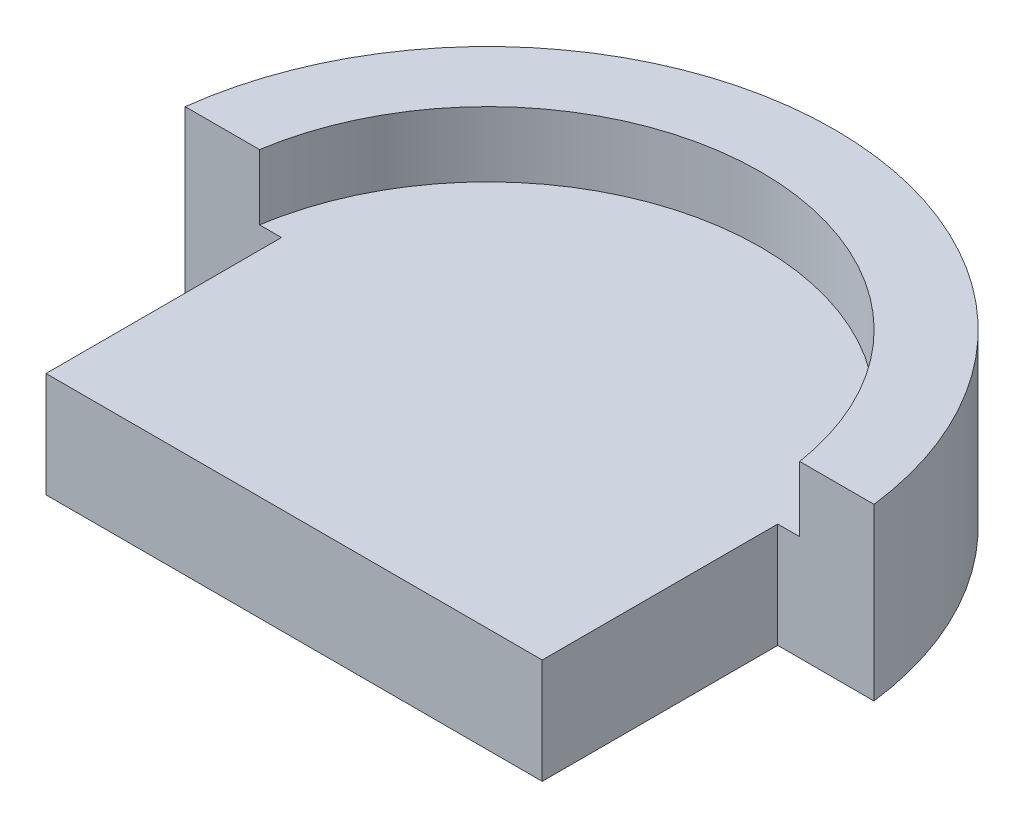
ISO-10303-21;
HEADER;
FILE_DESCRIPTION(('STEP AP214'),'2;1');
FILE_NAME('part.step','',(''),(''),'','','');
FILE_SCHEMA(('AUTOMOTIVE_DESIGN { 1 0 10303 214 1 1 1 1 }'));
ENDSEC;
DATA;
#1=APPLICATION_CONTEXT('core data for automotive mechanical design processes');
#2=APPLICATION_PROTOCOL_DEFINITION('international standard','automotive_design',2000,#1);
#3=PRODUCT_CONTEXT('',#1,'mechanical');
#4=PRODUCT('Part','Part','',(#3));
#5=PRODUCT_RELATED_PRODUCT_CATEGORY('part','',(#4));
#6=PRODUCT_DEFINITION_FORMATION('','',#4);
#7=PRODUCT_DEFINITION_CONTEXT('part definition',#1,'design');
#8=PRODUCT_DEFINITION('design','',#6,#7);
#9=PRODUCT_DEFINITION_SHAPE('','',#8);
#10=(LENGTH_UNIT() NAMED_UNIT(*) SI_UNIT(.MILLI.,.METRE.));
#11=(NAMED_UNIT(*) PLANE_ANGLE_UNIT() SI_UNIT($,.RADIAN.));
#12=(NAMED_UNIT(*) SI_UNIT($,.STERADIAN.) SOLID_ANGLE_UNIT());
#13=UNCERTAINTY_MEASURE_WITH_UNIT(LENGTH_MEASURE(1.E-05),#10,'distance_accuracy_value','');
#14=(GEOMETRIC_REPRESENTATION_CONTEXT(3) GLOBAL_UNCERTAINTY_ASSIGNED_CONTEXT((#13)) GLOBAL_UNIT_ASSIGNED_CONTEXT((#10,
#11,#12)) REPRESENTATION_CONTEXT('',''));
#15=CARTESIAN_POINT('',(0.,0.,0.));
#16=DIRECTION('',(0.,0.,1.));
#17=DIRECTION('',(1.,0.,0.));
#18=AXIS2_PLACEMENT_3D('',#15,#16,#17);
#19=CARTESIAN_POINT('',(0.,2.5,-4.6));
#20=DIRECTION('',(0.,1.,0.));
#21=DIRECTION('',(0.,0.,1.));
#22=AXIS2_PLACEMENT_3D('',#19,#20,#21);
#23=PLANE('',#22);
#24=CARTESIAN_POINT('',(0.,2.5,-4.6));
#25=DIRECTION('',(0.,-1.,0.));
#26=DIRECTION('',(0.,0.,1.));
#27=AXIS2_PLACEMENT_3D('',#24,#25,#26);
#28=CIRCLE('',#27,6.5);
#29=CARTESIAN_POINT('',(-6.42261628933257,2.5,-5.6));
#30=VERTEX_POINT('',#29);
#31=CARTESIAN_POINT('',(6.42261628933257,2.5,-5.6));
#32=VERTEX_POINT('',#31);
#33=EDGE_CURVE('E59',#30,#32,#28,.T.);
#34=ORIENTED_EDGE('',*,*,#33,.F.);
#35=DIRECTION('',(1.,0.,0.));
#36=VECTOR('',#35,1.);
#37=CARTESIAN_POINT('',(-8.1891696770796,2.5,-5.6));
#38=LINE('',#37,#36);
#39=CARTESIAN_POINT('',(-5.9,2.5,-5.6));
#40=VERTEX_POINT('',#39);
#41=EDGE_CURVE('E64',#30,#40,#38,.T.);
#42=ORIENTED_EDGE('',*,*,#41,.T.);
#43=DIRECTION('',(0.,0.,1.));
#44=VECTOR('',#43,1.);
#45=CARTESIAN_POINT('',(-5.9,2.5,0.));
#46=LINE('',#45,#44);
#47=CARTESIAN_POINT('',(-5.9,2.5,0.));
#48=VERTEX_POINT('',#47);
#49=EDGE_CURVE('E153',#40,#48,#46,.T.);
#50=ORIENTED_EDGE('',*,*,#49,.T.);
#51=DIRECTION('',(1.,0.,0.));
#52=VECTOR('',#51,1.);
#53=CARTESIAN_POINT('',(-5.9,2.5,0.));
#54=LINE('',#53,#52);
#55=CARTESIAN_POINT('',(5.9,2.5,0.));
#56=VERTEX_POINT('',#55);
#57=EDGE_CURVE('E100',#48,#56,#54,.T.);
#58=ORIENTED_EDGE('',*,*,#57,.T.);
#59=DIRECTION('',(0.,0.,-1.));
#60=VECTOR('',#59,1.);
#61=CARTESIAN_POINT('',(5.9,2.5,0.));
#62=LINE('',#61,#60);
#63=CARTESIAN_POINT('',(5.9,2.5,-5.6));
#64=VERTEX_POINT('',#63);
#65=EDGE_CURVE('E156',#56,#64,#62,.T.);
#66=ORIENTED_EDGE('',*,*,#65,.T.);
#67=DIRECTION('',(1.,0.,0.));
#68=VECTOR('',#67,1.);
#69=CARTESIAN_POINT('',(5.9,2.5,-5.6));
#70=LINE('',#69,#68);
#71=EDGE_CURVE('E158',#64,#32,#70,.T.);
#72=ORIENTED_EDGE('',*,*,#71,.T.);
#73=EDGE_LOOP('',(#34,#42,#50,#58,#66,#72));
#74=FACE_BOUND('',#73,.T.);
#75=ADVANCED_FACE('F44',(#74),#23,.T.);
#76=CARTESIAN_POINT('',(-5.9,2.5,0.));
#77=DIRECTION('',(1.,0.,0.));
#78=DIRECTION('',(0.,0.,-1.));
#79=AXIS2_PLACEMENT_3D('',#76,#77,#78);
#80=PLANE('',#79);
#81=DIRECTION('',(0.,0.,1.));
#82=VECTOR('',#81,1.);
#83=CARTESIAN_POINT('',(-5.9,0.,0.));
#84=LINE('',#83,#82);
#85=CARTESIAN_POINT('',(-5.9,0.,-5.6));
#86=VERTEX_POINT('',#85);
#87=CARTESIAN_POINT('',(-5.9,0.,0.));
#88=VERTEX_POINT('',#87);
#89=EDGE_CURVE('E152',#86,#88,#84,.T.);
#90=ORIENTED_EDGE('',*,*,#89,.T.);
#91=DIRECTION('',(0.,-1.,0.));
#92=VECTOR('',#91,1.);
#93=CARTESIAN_POINT('',(-5.9,2.5,0.));
#94=LINE('',#93,#92);
#95=EDGE_CURVE('E179',#48,#88,#94,.T.);
#96=ORIENTED_EDGE('',*,*,#95,.F.);
#97=ORIENTED_EDGE('',*,*,#49,.F.);
#98=DIRECTION('',(0.,-1.,0.));
#99=VECTOR('',#98,1.);
#100=CARTESIAN_POINT('',(-5.9,2.5,-5.6));
#101=LINE('',#100,#99);
#102=EDGE_CURVE('E125',#40,#86,#101,.T.);
#103=ORIENTED_EDGE('',*,*,#102,.T.);
#104=EDGE_LOOP('',(#90,#96,#97,#103));
#105=FACE_BOUND('',#104,.T.);
#106=ADVANCED_FACE('F46',(#105),#80,.F.);
#107=CARTESIAN_POINT('',(-5.9,2.5,0.));
#108=DIRECTION('',(0.,0.,-1.));
#109=DIRECTION('',(-1.,0.,0.));
#110=AXIS2_PLACEMENT_3D('',#107,#108,#109);
#111=PLANE('',#110);
#112=DIRECTION('',(1.,0.,0.));
#113=VECTOR('',#112,1.);
#114=CARTESIAN_POINT('',(-5.9,0.,0.));
#115=LINE('',#114,#113);
#116=CARTESIAN_POINT('',(5.9,0.,0.));
#117=VERTEX_POINT('',#116);
#118=EDGE_CURVE('E163',#88,#117,#115,.T.);
#119=ORIENTED_EDGE('',*,*,#118,.T.);
#120=DIRECTION('',(0.,-1.,0.));
#121=VECTOR('',#120,1.);
#122=CARTESIAN_POINT('',(5.9,2.5,0.));
#123=LINE('',#122,#121);
#124=EDGE_CURVE('E176',#56,#117,#123,.T.);
#125=ORIENTED_EDGE('',*,*,#124,.F.);
#126=ORIENTED_EDGE('',*,*,#57,.F.);
#127=ORIENTED_EDGE('',*,*,#95,.T.);
#128=EDGE_LOOP('',(#119,#125,#126,#127));
#129=FACE_BOUND('',#128,.T.);
#130=ADVANCED_FACE('F206',(#129),#111,.F.);
#131=CARTESIAN_POINT('',(5.9,2.5,0.));
#132=DIRECTION('',(-1.,0.,0.));
#133=DIRECTION('',(0.,0.,1.));
#134=AXIS2_PLACEMENT_3D('',#131,#132,#133);
#135=PLANE('',#134);
#136=DIRECTION('',(0.,0.,-1.));
#137=VECTOR('',#136,1.);
#138=CARTESIAN_POINT('',(5.9,0.,0.));
#139=LINE('',#138,#137);
#140=CARTESIAN_POINT('',(5.9,0.,-5.6));
#141=VERTEX_POINT('',#140);
#142=EDGE_CURVE('E165',#117,#141,#139,.T.);
#143=ORIENTED_EDGE('',*,*,#142,.T.);
#144=DIRECTION('',(0.,-1.,0.));
#145=VECTOR('',#144,1.);
#146=CARTESIAN_POINT('',(5.9,2.5,-5.6));
#147=LINE('',#146,#145);
#148=EDGE_CURVE('E173',#64,#141,#147,.T.);
#149=ORIENTED_EDGE('',*,*,#148,.F.);
#150=ORIENTED_EDGE('',*,*,#65,.F.);
#151=ORIENTED_EDGE('',*,*,#124,.T.);
#152=EDGE_LOOP('',(#143,#149,#150,#151));
#153=FACE_BOUND('',#152,.T.);
#154=ADVANCED_FACE('F204',(#153),#135,.F.);
#155=CARTESIAN_POINT('',(5.9,2.5,-5.6));
#156=DIRECTION('',(0.,0.,-1.));
#157=DIRECTION('',(-1.,0.,0.));
#158=AXIS2_PLACEMENT_3D('',#155,#156,#157);
#159=PLANE('',#158);
#160=DIRECTION('',(1.,0.,0.));
#161=VECTOR('',#160,1.);
#162=CARTESIAN_POINT('',(5.9,0.,-5.6));
#163=LINE('',#162,#161);
#164=CARTESIAN_POINT('',(8.1891696770796,0.,-5.6));
#165=VERTEX_POINT('',#164);
#166=EDGE_CURVE('E167',#141,#165,#163,.T.);
#167=ORIENTED_EDGE('',*,*,#166,.T.);
#168=DIRECTION('',(0.,-1.,0.));
#169=VECTOR('',#168,1.);
#170=CARTESIAN_POINT('',(8.1891696770796,2.5,-5.6));
#171=LINE('',#170,#169);
#172=CARTESIAN_POINT('',(8.1891696770796,4.05,-5.6));
#173=VERTEX_POINT('',#172);
#174=EDGE_CURVE('E124',#173,#165,#171,.T.);
#175=ORIENTED_EDGE('',*,*,#174,.F.);
#176=DIRECTION('',(1.,0.,0.));
#177=VECTOR('',#176,1.);
#178=CARTESIAN_POINT('',(6.42261628933257,4.05,-5.6));
#179=LINE('',#178,#177);
#180=CARTESIAN_POINT('',(6.42261628933257,4.05,-5.6));
#181=VERTEX_POINT('',#180);
#182=EDGE_CURVE('E139',#181,#173,#179,.T.);
#183=ORIENTED_EDGE('',*,*,#182,.F.);
#184=DIRECTION('',(0.,-1.,0.));
#185=VECTOR('',#184,1.);
#186=CARTESIAN_POINT('',(6.42261628933257,4.05,-5.6));
#187=LINE('',#186,#185);
#188=EDGE_CURVE('E147',#181,#32,#187,.T.);
#189=ORIENTED_EDGE('',*,*,#188,.T.);
#190=ORIENTED_EDGE('',*,*,#71,.F.);
#191=ORIENTED_EDGE('',*,*,#148,.T.);
#192=EDGE_LOOP('',(#167,#175,#183,#189,#190,#191));
#193=FACE_BOUND('',#192,.T.);
#194=ADVANCED_FACE('F200',(#193),#159,.F.);
#195=CARTESIAN_POINT('',(0.,2.5,-4.6));
#196=DIRECTION('',(0.,-1.,0.));
#197=DIRECTION('',(0.,0.,-1.));
#198=AXIS2_PLACEMENT_3D('',#195,#196,#197);
#199=CYLINDRICAL_SURFACE('',#198,8.25);
#200=CARTESIAN_POINT('',(0.,0.,-4.6));
#201=DIRECTION('',(0.,1.,0.));
#202=DIRECTION('',(0.,0.,1.));
#203=AXIS2_PLACEMENT_3D('',#200,#201,#202);
#204=CIRCLE('',#203,8.25);
#205=CARTESIAN_POINT('',(-8.1891696770796,0.,-5.6));
#206=VERTEX_POINT('',#205);
#207=EDGE_CURVE('E123',#165,#206,#204,.T.);
#208=ORIENTED_EDGE('',*,*,#207,.T.);
#209=DIRECTION('',(0.,-1.,0.));
#210=VECTOR('',#209,1.);
#211=CARTESIAN_POINT('',(-8.1891696770796,2.5,-5.6));
#212=LINE('',#211,#210);
#213=CARTESIAN_POINT('',(-8.1891696770796,4.05,-5.6));
#214=VERTEX_POINT('',#213);
#215=EDGE_CURVE('E116',#214,#206,#212,.T.);
#216=ORIENTED_EDGE('',*,*,#215,.F.);
#217=CARTESIAN_POINT('',(0.,4.05,-4.6));
#218=DIRECTION('',(0.,1.,0.));
#219=DIRECTION('',(0.,0.,1.));
#220=AXIS2_PLACEMENT_3D('',#217,#218,#219);
#221=CIRCLE('',#220,8.25);
#222=EDGE_CURVE('E121',#173,#214,#221,.T.);
#223=ORIENTED_EDGE('',*,*,#222,.F.);
#224=ORIENTED_EDGE('',*,*,#174,.T.);
#225=EDGE_LOOP('',(#208,#216,#223,#224));
#226=FACE_BOUND('',#225,.T.);
#227=ADVANCED_FACE('F118',(#226),#199,.T.);
#228=CARTESIAN_POINT('',(-8.1891696770796,2.5,-5.6));
#229=DIRECTION('',(0.,0.,-1.));
#230=DIRECTION('',(-1.,0.,0.));
#231=AXIS2_PLACEMENT_3D('',#228,#229,#230);
#232=PLANE('',#231);
#233=DIRECTION('',(1.,0.,0.));
#234=VECTOR('',#233,1.);
#235=CARTESIAN_POINT('',(-8.1891696770796,0.,-5.6));
#236=LINE('',#235,#234);
#237=EDGE_CURVE('E92',#206,#86,#236,.T.);
#238=ORIENTED_EDGE('',*,*,#237,.T.);
#239=ORIENTED_EDGE('',*,*,#102,.F.);
#240=ORIENTED_EDGE('',*,*,#41,.F.);
#241=DIRECTION('',(0.,-1.,0.));
#242=VECTOR('',#241,1.);
#243=CARTESIAN_POINT('',(-6.42261628933256,4.05,-5.6));
#244=LINE('',#243,#242);
#245=CARTESIAN_POINT('',(-6.42261628933256,4.05,-5.6));
#246=VERTEX_POINT('',#245);
#247=EDGE_CURVE('E131',#246,#30,#244,.T.);
#248=ORIENTED_EDGE('',*,*,#247,.F.);
#249=DIRECTION('',(1.,0.,0.));
#250=VECTOR('',#249,1.);
#251=CARTESIAN_POINT('',(-8.1891696770796,4.05,-5.6));
#252=LINE('',#251,#250);
#253=EDGE_CURVE('E128',#214,#246,#252,.T.);
#254=ORIENTED_EDGE('',*,*,#253,.F.);
#255=ORIENTED_EDGE('',*,*,#215,.T.);
#256=EDGE_LOOP('',(#238,#239,#240,#248,#254,#255));
#257=FACE_BOUND('',#256,.T.);
#258=ADVANCED_FACE('F129',(#257),#232,.F.);
#259=CARTESIAN_POINT('',(0.,0.,-4.6));
#260=DIRECTION('',(0.,1.,0.));
#261=DIRECTION('',(0.,0.,1.));
#262=AXIS2_PLACEMENT_3D('',#259,#260,#261);
#263=PLANE('',#262);
#264=CARTESIAN_POINT('',(2.5,0.,-4.1));
#265=DIRECTION('',(0.,1.,0.));
#266=DIRECTION('',(0.,0.,1.));
#267=AXIS2_PLACEMENT_3D('',#264,#265,#266);
#268=CIRCLE('',#267,0.5);
#269=CARTESIAN_POINT('',(2.5,0.,-3.6));
#270=VERTEX_POINT('',#269);
#271=EDGE_CURVE('E11',#270,#270,#268,.F.);
#272=ORIENTED_EDGE('',*,*,#271,.F.);
#273=EDGE_LOOP('',(#272));
#274=FACE_BOUND('',#273,.T.);
#275=CARTESIAN_POINT('',(-2.5,0.,-4.1));
#276=DIRECTION('',(0.,1.,0.));
#277=DIRECTION('',(0.,0.,1.));
#278=AXIS2_PLACEMENT_3D('',#275,#276,#277);
#279=CIRCLE('',#278,0.5);
#280=CARTESIAN_POINT('',(-2.5,0.,-3.6));
#281=VERTEX_POINT('',#280);
#282=EDGE_CURVE('E52',#281,#281,#279,.F.);
#283=ORIENTED_EDGE('',*,*,#282,.F.);
#284=EDGE_LOOP('',(#283));
#285=FACE_BOUND('',#284,.T.);
#286=ORIENTED_EDGE('',*,*,#89,.F.);
#287=ORIENTED_EDGE('',*,*,#237,.F.);
#288=ORIENTED_EDGE('',*,*,#207,.F.);
#289=ORIENTED_EDGE('',*,*,#166,.F.);
#290=ORIENTED_EDGE('',*,*,#142,.F.);
#291=ORIENTED_EDGE('',*,*,#118,.F.);
#292=EDGE_LOOP('',(#286,#287,#288,#289,#290,#291));
#293=FACE_BOUND('',#292,.T.);
#294=ADVANCED_FACE('F185',(#274,#285,#293),#263,.F.);
#295=CARTESIAN_POINT('',(0.,4.05,-4.6));
#296=DIRECTION('',(0.,-1.,0.));
#297=DIRECTION('',(0.,0.,-1.));
#298=AXIS2_PLACEMENT_3D('',#295,#296,#297);
#299=CYLINDRICAL_SURFACE('',#298,6.5);
#300=ORIENTED_EDGE('',*,*,#33,.T.);
#301=ORIENTED_EDGE('',*,*,#188,.F.);
#302=CARTESIAN_POINT('',(0.,4.05,-4.6));
#303=DIRECTION('',(0.,-1.,0.));
#304=DIRECTION('',(0.,0.,1.));
#305=AXIS2_PLACEMENT_3D('',#302,#303,#304);
#306=CIRCLE('',#305,6.5);
#307=EDGE_CURVE('E134',#246,#181,#306,.T.);
#308=ORIENTED_EDGE('',*,*,#307,.F.);
#309=ORIENTED_EDGE('',*,*,#247,.T.);
#310=EDGE_LOOP('',(#300,#301,#308,#309));
#311=FACE_BOUND('',#310,.T.);
#312=ADVANCED_FACE('F188',(#311),#299,.F.);
#313=CARTESIAN_POINT('',(0.,4.05,-4.6));
#314=DIRECTION('',(0.,1.,0.));
#315=DIRECTION('',(0.,0.,1.));
#316=AXIS2_PLACEMENT_3D('',#313,#314,#315);
#317=PLANE('',#316);
#318=ORIENTED_EDGE('',*,*,#222,.T.);
#319=ORIENTED_EDGE('',*,*,#253,.T.);
#320=ORIENTED_EDGE('',*,*,#307,.T.);
#321=ORIENTED_EDGE('',*,*,#182,.T.);
#322=EDGE_LOOP('',(#318,#319,#320,#321));
#323=FACE_BOUND('',#322,.T.);
#324=ADVANCED_FACE('F137',(#323),#317,.T.);
#325=CARTESIAN_POINT('',(-2.5,-0.5,-4.1));
#326=DIRECTION('',(0.,1.,0.));
#327=DIRECTION('',(0.,0.,1.));
#328=AXIS2_PLACEMENT_3D('',#325,#326,#327);
#329=CYLINDRICAL_SURFACE('',#328,0.5);
#330=CARTESIAN_POINT('',(-2.5,-0.5,-4.1));
#331=DIRECTION('',(0.,-1.,0.));
#332=DIRECTION('',(0.,0.,-1.));
#333=AXIS2_PLACEMENT_3D('',#330,#331,#332);
#334=CIRCLE('',#333,0.5);
#335=CARTESIAN_POINT('',(-2.5,-0.5,-4.6));
#336=VERTEX_POINT('',#335);
#337=EDGE_CURVE('E141',#336,#336,#334,.T.);
#338=ORIENTED_EDGE('',*,*,#337,.F.);
#339=EDGE_LOOP('',(#338));
#340=FACE_BOUND('',#339,.T.);
#341=ORIENTED_EDGE('',*,*,#282,.T.);
#342=EDGE_LOOP('',(#341));
#343=FACE_BOUND('',#342,.T.);
#344=ADVANCED_FACE('F183',(#340,#343),#329,.T.);
#345=CARTESIAN_POINT('',(-2.5,-0.5,-4.1));
#346=DIRECTION('',(0.,-1.,0.));
#347=DIRECTION('',(0.,0.,-1.));
#348=AXIS2_PLACEMENT_3D('',#345,#346,#347);
#349=PLANE('',#348);
#350=ORIENTED_EDGE('',*,*,#337,.T.);
#351=EDGE_LOOP('',(#350));
#352=FACE_BOUND('',#351,.T.);
#353=ADVANCED_FACE('F257',(#352),#349,.T.);
#354=CARTESIAN_POINT('',(2.5,-0.5,-4.1));
#355=DIRECTION('',(0.,1.,0.));
#356=DIRECTION('',(0.,0.,1.));
#357=AXIS2_PLACEMENT_3D('',#354,#355,#356);
#358=CYLINDRICAL_SURFACE('',#357,0.5);
#359=CARTESIAN_POINT('',(2.5,-0.5,-4.1));
#360=DIRECTION('',(0.,-1.,0.));
#361=DIRECTION('',(0.,0.,-1.));
#362=AXIS2_PLACEMENT_3D('',#359,#360,#361);
#363=CIRCLE('',#362,0.5);
#364=CARTESIAN_POINT('',(2.5,-0.5,-4.6));
#365=VERTEX_POINT('',#364);
#366=EDGE_CURVE('E362',#365,#365,#363,.T.);
#367=ORIENTED_EDGE('',*,*,#366,.F.);
#368=EDGE_LOOP('',(#367));
#369=FACE_BOUND('',#368,.T.);
#370=ORIENTED_EDGE('',*,*,#271,.T.);
#371=EDGE_LOOP('',(#370));
#372=FACE_BOUND('',#371,.T.);
#373=ADVANCED_FACE('F265',(#369,#372),#358,.T.);
#374=CARTESIAN_POINT('',(2.5,-0.5,-4.1));
#375=DIRECTION('',(0.,-1.,0.));
#376=DIRECTION('',(0.,0.,-1.));
#377=AXIS2_PLACEMENT_3D('',#374,#375,#376);
#378=PLANE('',#377);
#379=ORIENTED_EDGE('',*,*,#366,.T.);
#380=EDGE_LOOP('',(#379));
#381=FACE_BOUND('',#380,.T.);
#382=ADVANCED_FACE('F273',(#381),#378,.T.);
#383=CLOSED_SHELL('',(#75,#106,#130,#154,#194,#227,#258,#294,#312,#324,#344,#353,#373,#382));
#384=MANIFOLD_SOLID_BREP('B2',#383);
#385=ADVANCED_BREP_SHAPE_REPRESENTATION('',(#18,#384),#14);
#386=SHAPE_DEFINITION_REPRESENTATION(#9,#385);
ENDSEC;
END-ISO-10303-21;
